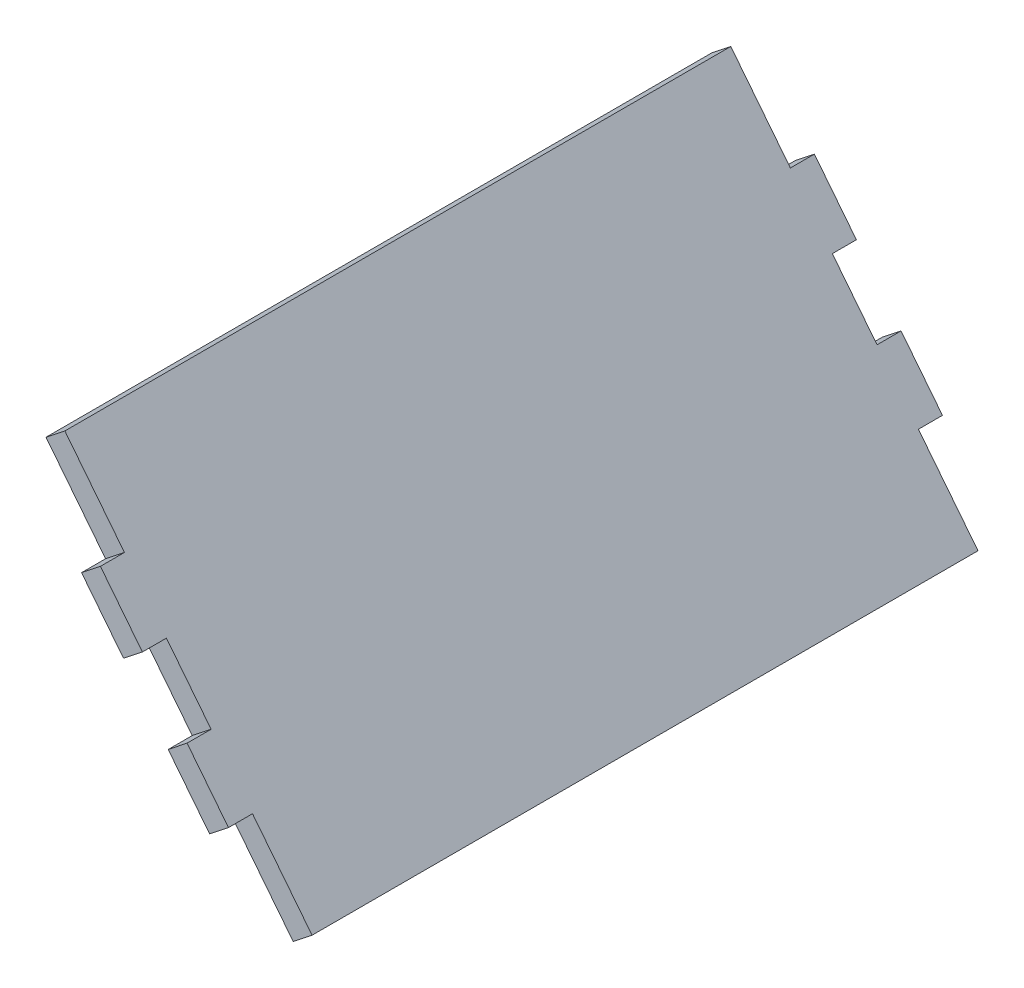
ISO-10303-21;
HEADER;
FILE_DESCRIPTION(('STEP AP214'),'2;1');
FILE_NAME('part.step','',(''),(''),'','','');
FILE_SCHEMA(('AUTOMOTIVE_DESIGN { 1 0 10303 214 1 1 1 1 }'));
ENDSEC;
DATA;
#1=APPLICATION_CONTEXT('core data for automotive mechanical design processes');
#2=APPLICATION_PROTOCOL_DEFINITION('international standard','automotive_design',2000,#1);
#3=PRODUCT_CONTEXT('',#1,'mechanical');
#4=PRODUCT('Part','Part','',(#3));
#5=PRODUCT_RELATED_PRODUCT_CATEGORY('part','',(#4));
#6=PRODUCT_DEFINITION_FORMATION('','',#4);
#7=PRODUCT_DEFINITION_CONTEXT('part definition',#1,'design');
#8=PRODUCT_DEFINITION('design','',#6,#7);
#9=PRODUCT_DEFINITION_SHAPE('','',#8);
#10=(LENGTH_UNIT() NAMED_UNIT(*) SI_UNIT(.MILLI.,.METRE.));
#11=(NAMED_UNIT(*) PLANE_ANGLE_UNIT() SI_UNIT($,.RADIAN.));
#12=(NAMED_UNIT(*) SI_UNIT($,.STERADIAN.) SOLID_ANGLE_UNIT());
#13=UNCERTAINTY_MEASURE_WITH_UNIT(LENGTH_MEASURE(1.E-05),#10,'distance_accuracy_value','');
#14=(GEOMETRIC_REPRESENTATION_CONTEXT(3) GLOBAL_UNCERTAINTY_ASSIGNED_CONTEXT((#13)) GLOBAL_UNIT_ASSIGNED_CONTEXT((#10,
#11,#12)) REPRESENTATION_CONTEXT('',''));
#15=CARTESIAN_POINT('',(0.,0.,0.));
#16=DIRECTION('',(0.,0.,1.));
#17=DIRECTION('',(1.,0.,0.));
#18=AXIS2_PLACEMENT_3D('',#15,#16,#17);
#19=CARTESIAN_POINT('',(-92.709964426378,65.3502134877913,-94.3225113786893));
#20=DIRECTION('',(-0.784882765533394,-0.619644288579062,0.));
#21=DIRECTION('',(0.619644288579062,-0.784882765533394,0.));
#22=AXIS2_PLACEMENT_3D('',#19,#20,#21);
#23=PLANE('',#22);
#24=DIRECTION('',(0.619644288579062,-0.784882765533394,0.));
#25=VECTOR('',#24,1.);
#26=CARTESIAN_POINT('',(-92.709964426378,65.3502134877913,-3.175));
#27=LINE('',#26,#25);
#28=CARTESIAN_POINT('',(-67.9212374961534,33.9511593761769,-3.17499999999999));
#29=VERTEX_POINT('',#28);
#30=CARTESIAN_POINT('',(-60.0517550311992,23.9831482539026,-3.17500000000017));
#31=VERTEX_POINT('',#30);
#32=EDGE_CURVE('E177',#29,#31,#27,.T.);
#33=ORIENTED_EDGE('',*,*,#32,.F.);
#34=DIRECTION('',(0.,0.,1.));
#35=VECTOR('',#34,1.);
#36=CARTESIAN_POINT('',(-67.9212374961535,33.9511593761769,-94.3225113786893));
#37=LINE('',#36,#35);
#38=CARTESIAN_POINT('',(-67.9212374961535,33.9511593761769,1.32272665043232E-13));
#39=VERTEX_POINT('',#38);
#40=EDGE_CURVE('E358',#29,#39,#37,.T.);
#41=ORIENTED_EDGE('',*,*,#40,.T.);
#42=DIRECTION('',(0.619644288579062,-0.784882765533394,0.));
#43=VECTOR('',#42,1.);
#44=CARTESIAN_POINT('',(-92.709964426378,65.3502134877913,0.));
#45=LINE('',#44,#43);
#46=CARTESIAN_POINT('',(-73.3905278092966,40.8789271061575,0.));
#47=VERTEX_POINT('',#46);
#48=EDGE_CURVE('E238',#47,#39,#45,.T.);
#49=ORIENTED_EDGE('',*,*,#48,.F.);
#50=DIRECTION('',(0.,0.,1.));
#51=VECTOR('',#50,1.);
#52=CARTESIAN_POINT('',(-73.3905278092968,40.8789271061577,-94.3225113786893));
#53=LINE('',#52,#51);
#54=CARTESIAN_POINT('',(-73.3905278092966,40.8789271061575,-3.17500000000011));
#55=VERTEX_POINT('',#54);
#56=EDGE_CURVE('E55',#55,#47,#53,.T.);
#57=ORIENTED_EDGE('',*,*,#56,.F.);
#58=DIRECTION('',(-0.619644288579062,0.784882765533394,0.));
#59=VECTOR('',#58,1.);
#60=CARTESIAN_POINT('',(-92.7099644263781,65.3502134877914,-3.17500000000001));
#61=LINE('',#60,#59);
#62=CARTESIAN_POINT('',(-79.2926396580122,48.3549354478631,-3.17500000000001));
#63=VERTEX_POINT('',#62);
#64=EDGE_CURVE('E333',#55,#63,#61,.T.);
#65=ORIENTED_EDGE('',*,*,#64,.T.);
#66=DIRECTION('',(0.,0.,1.));
#67=VECTOR('',#66,1.);
#68=CARTESIAN_POINT('',(-79.2926396580122,48.3549354478632,-94.3225113786893));
#69=LINE('',#68,#67);
#70=CARTESIAN_POINT('',(-79.2926396580122,48.3549354478631,0.));
#71=VERTEX_POINT('',#70);
#72=EDGE_CURVE('E337',#63,#71,#69,.T.);
#73=ORIENTED_EDGE('',*,*,#72,.T.);
#74=CARTESIAN_POINT('',(-84.8404819614249,55.3822023655185,0.));
#75=VERTEX_POINT('',#74);
#76=EDGE_CURVE('E225',#75,#71,#45,.T.);
#77=ORIENTED_EDGE('',*,*,#76,.F.);
#78=DIRECTION('',(0.,0.,1.));
#79=VECTOR('',#78,1.);
#80=CARTESIAN_POINT('',(-84.8404819614249,55.3822023655185,-94.3225113786893));
#81=LINE('',#80,#79);
#82=CARTESIAN_POINT('',(-84.8404819614249,55.3822023655185,-3.17500000000002));
#83=VERTEX_POINT('',#82);
#84=EDGE_CURVE('E260',#83,#75,#81,.T.);
#85=ORIENTED_EDGE('',*,*,#84,.F.);
#86=DIRECTION('',(-0.619644288579062,0.784882765533394,0.));
#87=VECTOR('',#86,1.);
#88=CARTESIAN_POINT('',(-92.709964426378,65.3502134877913,-3.17500000000003));
#89=LINE('',#88,#87);
#90=CARTESIAN_POINT('',(-92.709964426379,65.3502134877926,-3.17500000000006));
#91=VERTEX_POINT('',#90);
#92=EDGE_CURVE('E259',#83,#91,#89,.T.);
#93=ORIENTED_EDGE('',*,*,#92,.T.);
#94=DIRECTION('',(0.,0.,1.));
#95=VECTOR('',#94,1.);
#96=CARTESIAN_POINT('',(-92.709964426378,65.3502134877913,-94.3225113786893));
#97=LINE('',#96,#95);
#98=CARTESIAN_POINT('',(-92.7099644263782,65.3502134877915,-91.1475113786894));
#99=VERTEX_POINT('',#98);
#100=EDGE_CURVE('E197',#99,#91,#97,.T.);
#101=ORIENTED_EDGE('',*,*,#100,.F.);
#102=DIRECTION('',(-0.619644288579062,0.784882765533394,0.));
#103=VECTOR('',#102,1.);
#104=CARTESIAN_POINT('',(-92.709964426378,65.3502134877913,-91.1475113786894));
#105=LINE('',#104,#103);
#106=CARTESIAN_POINT('',(-84.8404819614241,55.3822023655174,-91.1475113786894));
#107=VERTEX_POINT('',#106);
#108=EDGE_CURVE('E236',#107,#99,#105,.T.);
#109=ORIENTED_EDGE('',*,*,#108,.F.);
#110=DIRECTION('',(0.,0.,-1.));
#111=VECTOR('',#110,1.);
#112=CARTESIAN_POINT('',(-84.8404819614241,55.3822023655175,-94.3225113786893));
#113=LINE('',#112,#111);
#114=CARTESIAN_POINT('',(-84.8404819614241,55.3822023655175,-94.3225113786895));
#115=VERTEX_POINT('',#114);
#116=EDGE_CURVE('E239',#107,#115,#113,.T.);
#117=ORIENTED_EDGE('',*,*,#116,.T.);
#118=DIRECTION('',(0.619644288579062,-0.784882765533394,0.));
#119=VECTOR('',#118,1.);
#120=CARTESIAN_POINT('',(-92.709964426378,65.3502134877913,-94.3225113786893));
#121=LINE('',#120,#119);
#122=CARTESIAN_POINT('',(-79.292639658011,48.3549354478616,-94.3225113786898));
#123=VERTEX_POINT('',#122);
#124=EDGE_CURVE('E194',#115,#123,#121,.T.);
#125=ORIENTED_EDGE('',*,*,#124,.T.);
#126=DIRECTION('',(0.,0.,-1.));
#127=VECTOR('',#126,1.);
#128=CARTESIAN_POINT('',(-79.292639658011,48.3549354478616,-94.3225113786893));
#129=LINE('',#128,#127);
#130=CARTESIAN_POINT('',(-79.292639658011,48.3549354478616,-91.1475113786896));
#131=VERTEX_POINT('',#130);
#132=EDGE_CURVE('E298',#131,#123,#129,.T.);
#133=ORIENTED_EDGE('',*,*,#132,.F.);
#134=DIRECTION('',(-0.619644288579062,0.784882765533394,0.));
#135=VECTOR('',#134,1.);
#136=CARTESIAN_POINT('',(-92.709964426378,65.3502134877913,-91.1475113786894));
#137=LINE('',#136,#135);
#138=CARTESIAN_POINT('',(-73.3905278092954,40.878927106156,-91.1475113786896));
#139=VERTEX_POINT('',#138);
#140=EDGE_CURVE('E300',#139,#131,#137,.T.);
#141=ORIENTED_EDGE('',*,*,#140,.F.);
#142=DIRECTION('',(0.,0.,-1.));
#143=VECTOR('',#142,1.);
#144=CARTESIAN_POINT('',(-73.3905278092955,40.8789271061561,-94.3225113786892));
#145=LINE('',#144,#143);
#146=CARTESIAN_POINT('',(-73.3905278092954,40.878927106156,-94.3225113786897));
#147=VERTEX_POINT('',#146);
#148=EDGE_CURVE('E294',#139,#147,#145,.T.);
#149=ORIENTED_EDGE('',*,*,#148,.T.);
#150=CARTESIAN_POINT('',(-67.9212374961523,33.9511593761755,-94.3225113786894));
#151=VERTEX_POINT('',#150);
#152=EDGE_CURVE('E200',#147,#151,#121,.T.);
#153=ORIENTED_EDGE('',*,*,#152,.T.);
#154=DIRECTION('',(0.,0.,-1.));
#155=VECTOR('',#154,1.);
#156=CARTESIAN_POINT('',(-67.9212374961524,33.9511593761755,-94.3225113786893));
#157=LINE('',#156,#155);
#158=CARTESIAN_POINT('',(-67.9212374961524,33.9511593761756,-91.1475113786897));
#159=VERTEX_POINT('',#158);
#160=EDGE_CURVE('E280',#159,#151,#157,.T.);
#161=ORIENTED_EDGE('',*,*,#160,.F.);
#162=DIRECTION('',(0.619644288579062,-0.784882765533394,0.));
#163=VECTOR('',#162,1.);
#164=CARTESIAN_POINT('',(-92.709964426378,65.3502134877913,-91.1475113786894));
#165=LINE('',#164,#163);
#166=CARTESIAN_POINT('',(-60.0517550311982,23.9831482539014,-91.1475113786896));
#167=VERTEX_POINT('',#166);
#168=EDGE_CURVE('E276',#159,#167,#165,.T.);
#169=ORIENTED_EDGE('',*,*,#168,.T.);
#170=DIRECTION('',(0.,0.,1.));
#171=VECTOR('',#170,1.);
#172=CARTESIAN_POINT('',(-60.0517550311979,23.983148253901,-94.3225113786893));
#173=LINE('',#172,#171);
#174=EDGE_CURVE('E207',#167,#31,#173,.T.);
#175=ORIENTED_EDGE('',*,*,#174,.T.);
#176=EDGE_LOOP('',(#33,#41,#49,#57,#65,#73,#77,#85,#93,#101,#109,#117,#125,#133,#141,#149,#153,
#161,#169,#175));
#177=FACE_BOUND('',#176,.T.);
#178=ADVANCED_FACE('F33',(#177),#23,.T.);
#179=CARTESIAN_POINT('',(-57.5597522506294,25.9505188701395,-94.3225113786893));
#180=DIRECTION('',(0.784882765533394,0.619644288579062,0.));
#181=DIRECTION('',(-0.619644288579062,0.784882765533394,0.));
#182=AXIS2_PLACEMENT_3D('',#179,#180,#181);
#183=PLANE('',#182);
#184=DIRECTION('',(-0.619644288579062,0.784882765533394,0.));
#185=VECTOR('',#184,1.);
#186=CARTESIAN_POINT('',(-57.5597522506294,25.9505188701395,0.));
#187=LINE('',#186,#185);
#188=CARTESIAN_POINT('',(-65.4292347155827,35.9185299924127,0.));
#189=VERTEX_POINT('',#188);
#190=CARTESIAN_POINT('',(-70.8985250287306,42.8462977223941,0.));
#191=VERTEX_POINT('',#190);
#192=EDGE_CURVE('E235',#189,#191,#187,.T.);
#193=ORIENTED_EDGE('',*,*,#192,.F.);
#194=DIRECTION('',(0.,0.,-1.));
#195=VECTOR('',#194,1.);
#196=CARTESIAN_POINT('',(-65.4292347155873,35.9185299924136,1.32272665043232E-13));
#197=LINE('',#196,#195);
#198=CARTESIAN_POINT('',(-65.4292347155871,35.9185299924136,-3.17499999999997));
#199=VERTEX_POINT('',#198);
#200=EDGE_CURVE('E48',#189,#199,#197,.T.);
#201=ORIENTED_EDGE('',*,*,#200,.T.);
#202=DIRECTION('',(-0.619644288579095,0.784882765533393,0.));
#203=VECTOR('',#202,1.);
#204=CARTESIAN_POINT('',(-22.8381786424668,-18.0301410335283,-3.17500000000002));
#205=LINE('',#204,#203);
#206=CARTESIAN_POINT('',(-57.5597522506328,25.9505188701395,-3.17500000000017));
#207=VERTEX_POINT('',#206);
#208=EDGE_CURVE('E175',#207,#199,#205,.T.);
#209=ORIENTED_EDGE('',*,*,#208,.F.);
#210=DIRECTION('',(0.,0.,1.));
#211=VECTOR('',#210,1.);
#212=CARTESIAN_POINT('',(-57.5597522506294,25.9505188701395,-94.3225113786893));
#213=LINE('',#212,#211);
#214=CARTESIAN_POINT('',(-57.5597522506294,25.9505188701395,-91.1475113786896));
#215=VERTEX_POINT('',#214);
#216=EDGE_CURVE('E189',#215,#207,#213,.T.);
#217=ORIENTED_EDGE('',*,*,#216,.F.);
#218=DIRECTION('',(-0.619644288579071,0.784882765533393,0.));
#219=VECTOR('',#218,1.);
#220=CARTESIAN_POINT('',(-22.8381786424668,-18.0301410335283,-91.1475113786894));
#221=LINE('',#220,#219);
#222=CARTESIAN_POINT('',(-65.4292347155844,35.9185299924136,-91.1475113786897));
#223=VERTEX_POINT('',#222);
#224=EDGE_CURVE('E263',#215,#223,#221,.T.);
#225=ORIENTED_EDGE('',*,*,#224,.T.);
#226=DIRECTION('',(0.,0.,1.));
#227=VECTOR('',#226,1.);
#228=CARTESIAN_POINT('',(-65.4292347155844,35.9185299924136,0.));
#229=LINE('',#228,#227);
#230=CARTESIAN_POINT('',(-65.4292347155842,35.9185299924136,-94.3225113786896));
#231=VERTEX_POINT('',#230);
#232=EDGE_CURVE('E265',#231,#223,#229,.T.);
#233=ORIENTED_EDGE('',*,*,#232,.F.);
#234=DIRECTION('',(-0.619644288579062,0.784882765533394,0.));
#235=VECTOR('',#234,1.);
#236=CARTESIAN_POINT('',(-57.5597522506294,25.9505188701395,-94.3225113786893));
#237=LINE('',#236,#235);
#238=CARTESIAN_POINT('',(-70.8985250287265,42.846297722394,-94.3225113786893));
#239=VERTEX_POINT('',#238);
#240=EDGE_CURVE('E311',#231,#239,#237,.T.);
#241=ORIENTED_EDGE('',*,*,#240,.T.);
#242=DIRECTION('',(0.,0.,1.));
#243=VECTOR('',#242,1.);
#244=CARTESIAN_POINT('',(-70.8985250287277,42.8462977223943,-2.6324428747948E-13));
#245=LINE('',#244,#243);
#246=CARTESIAN_POINT('',(-70.8985250287274,42.8462977223941,-91.1475113786897));
#247=VERTEX_POINT('',#246);
#248=EDGE_CURVE('E288',#239,#247,#245,.T.);
#249=ORIENTED_EDGE('',*,*,#248,.T.);
#250=DIRECTION('',(0.619644288579069,-0.784882765533393,0.));
#251=VECTOR('',#250,1.);
#252=CARTESIAN_POINT('',(-22.838178642467,-18.0301410335282,-91.1475113786896));
#253=LINE('',#252,#251);
#254=CARTESIAN_POINT('',(-76.8006368774431,50.3223060640997,-91.1475113786898));
#255=VERTEX_POINT('',#254);
#256=EDGE_CURVE('E285',#255,#247,#253,.T.);
#257=ORIENTED_EDGE('',*,*,#256,.F.);
#258=DIRECTION('',(0.,0.,1.));
#259=VECTOR('',#258,1.);
#260=CARTESIAN_POINT('',(-76.8006368774431,50.3223060640997,0.));
#261=LINE('',#260,#259);
#262=CARTESIAN_POINT('',(-76.800636877443,50.3223060640997,-94.3225113786898));
#263=VERTEX_POINT('',#262);
#264=EDGE_CURVE('E282',#263,#255,#261,.T.);
#265=ORIENTED_EDGE('',*,*,#264,.F.);
#266=CARTESIAN_POINT('',(-82.3484791808554,57.3495729817558,-94.3225113786893));
#267=VERTEX_POINT('',#266);
#268=EDGE_CURVE('E244',#263,#267,#237,.T.);
#269=ORIENTED_EDGE('',*,*,#268,.T.);
#270=DIRECTION('',(0.,0.,1.));
#271=VECTOR('',#270,1.);
#272=CARTESIAN_POINT('',(-82.3484791808559,57.3495729817558,0.));
#273=LINE('',#272,#271);
#274=CARTESIAN_POINT('',(-82.3484791808558,57.3495729817558,-91.1475113786894));
#275=VERTEX_POINT('',#274);
#276=EDGE_CURVE('E305',#267,#275,#273,.T.);
#277=ORIENTED_EDGE('',*,*,#276,.T.);
#278=DIRECTION('',(0.619644288579065,-0.784882765533393,0.));
#279=VECTOR('',#278,1.);
#280=CARTESIAN_POINT('',(-22.8381786424668,-18.0301410335283,-91.1475113786894));
#281=LINE('',#280,#279);
#282=CARTESIAN_POINT('',(-90.21796164581,67.3175841040298,-91.1475113786894));
#283=VERTEX_POINT('',#282);
#284=EDGE_CURVE('E302',#283,#275,#281,.T.);
#285=ORIENTED_EDGE('',*,*,#284,.F.);
#286=DIRECTION('',(0.,0.,1.));
#287=VECTOR('',#286,1.);
#288=CARTESIAN_POINT('',(-90.2179616458095,67.3175841040298,-94.3225113786893));
#289=LINE('',#288,#287);
#290=CARTESIAN_POINT('',(-90.2179616458121,67.3175841040298,-3.17500000000006));
#291=VERTEX_POINT('',#290);
#292=EDGE_CURVE('E193',#283,#291,#289,.T.);
#293=ORIENTED_EDGE('',*,*,#292,.T.);
#294=DIRECTION('',(0.619644288579081,-0.784882765533393,0.));
#295=VECTOR('',#294,1.);
#296=CARTESIAN_POINT('',(-22.8381786424668,-18.0301410335283,-3.17500000000002));
#297=LINE('',#296,#295);
#298=CARTESIAN_POINT('',(-82.348479180858,57.3495729817558,-3.17500000000002));
#299=VERTEX_POINT('',#298);
#300=EDGE_CURVE('E332',#291,#299,#297,.T.);
#301=ORIENTED_EDGE('',*,*,#300,.T.);
#302=DIRECTION('',(0.,0.,-1.));
#303=VECTOR('',#302,1.);
#304=CARTESIAN_POINT('',(-82.348479180858,57.3495729817558,0.));
#305=LINE('',#304,#303);
#306=CARTESIAN_POINT('',(-82.348479180858,57.3495729817558,0.));
#307=VERTEX_POINT('',#306);
#308=EDGE_CURVE('E234',#307,#299,#305,.T.);
#309=ORIENTED_EDGE('',*,*,#308,.F.);
#310=CARTESIAN_POINT('',(-76.8006368774463,50.3223060640997,0.));
#311=VERTEX_POINT('',#310);
#312=EDGE_CURVE('E223',#311,#307,#187,.T.);
#313=ORIENTED_EDGE('',*,*,#312,.F.);
#314=DIRECTION('',(0.,0.,-1.));
#315=VECTOR('',#314,1.);
#316=CARTESIAN_POINT('',(-76.8006368774463,50.3223060640997,0.));
#317=LINE('',#316,#315);
#318=CARTESIAN_POINT('',(-76.8006368774462,50.3223060640997,-3.17500000000002));
#319=VERTEX_POINT('',#318);
#320=EDGE_CURVE('E231',#311,#319,#317,.T.);
#321=ORIENTED_EDGE('',*,*,#320,.T.);
#322=DIRECTION('',(0.619644288579094,-0.784882765533393,0.));
#323=VECTOR('',#322,1.);
#324=CARTESIAN_POINT('',(-22.8381786424668,-18.0301410335283,-3.17499999999988));
#325=LINE('',#324,#323);
#326=CARTESIAN_POINT('',(-70.8985250287305,42.8462977223941,-3.17500000000011));
#327=VERTEX_POINT('',#326);
#328=EDGE_CURVE('E350',#319,#327,#325,.T.);
#329=ORIENTED_EDGE('',*,*,#328,.T.);
#330=DIRECTION('',(0.,0.,-1.));
#331=VECTOR('',#330,1.);
#332=CARTESIAN_POINT('',(-70.8985250287304,42.8462977223941,1.73906028466675E-13));
#333=LINE('',#332,#331);
#334=EDGE_CURVE('E353',#191,#327,#333,.T.);
#335=ORIENTED_EDGE('',*,*,#334,.F.);
#336=EDGE_LOOP('',(#193,#201,#209,#217,#225,#233,#241,#249,#257,#265,#269,#277,#285,#293,#301,
#309,#313,#321,#329,#335));
#337=FACE_BOUND('',#336,.T.);
#338=ADVANCED_FACE('F187',(#337),#183,.T.);
#339=CARTESIAN_POINT('',(0.,0.,0.));
#340=DIRECTION('',(0.,0.,1.));
#341=DIRECTION('',(1.,0.,0.));
#342=AXIS2_PLACEMENT_3D('',#339,#340,#341);
#343=PLANE('',#342);
#344=ORIENTED_EDGE('',*,*,#48,.T.);
#345=DIRECTION('',(0.784882765533394,0.619644288579062,0.));
#346=VECTOR('',#345,1.);
#347=CARTESIAN_POINT('',(-42.5910560731182,53.9486710259438,0.));
#348=LINE('',#347,#346);
#349=EDGE_CURVE('E11',#39,#189,#348,.T.);
#350=ORIENTED_EDGE('',*,*,#349,.T.);
#351=ORIENTED_EDGE('',*,*,#192,.T.);
#352=DIRECTION('',(0.784882765533394,0.619644288579062,0.));
#353=VECTOR('',#352,1.);
#354=CARTESIAN_POINT('',(-48.0603463862613,60.8764387559244,0.));
#355=LINE('',#354,#353);
#356=EDGE_CURVE('E216',#47,#191,#355,.T.);
#357=ORIENTED_EDGE('',*,*,#356,.F.);
#358=EDGE_LOOP('',(#344,#350,#351,#357));
#359=FACE_BOUND('',#358,.T.);
#360=ADVANCED_FACE('F399',(#359),#343,.T.);
#361=ORIENTED_EDGE('',*,*,#76,.T.);
#362=DIRECTION('',(0.784882765533394,0.619644288579062,0.));
#363=VECTOR('',#362,1.);
#364=CARTESIAN_POINT('',(-53.9624582349769,68.35244709763,0.));
#365=LINE('',#364,#363);
#366=EDGE_CURVE('E41',#71,#311,#365,.T.);
#367=ORIENTED_EDGE('',*,*,#366,.T.);
#368=ORIENTED_EDGE('',*,*,#312,.T.);
#369=DIRECTION('',(0.784882765533394,0.619644288579062,0.));
#370=VECTOR('',#369,1.);
#371=CARTESIAN_POINT('',(-59.5103005383897,75.3797140152854,0.));
#372=LINE('',#371,#370);
#373=EDGE_CURVE('E213',#75,#307,#372,.T.);
#374=ORIENTED_EDGE('',*,*,#373,.F.);
#375=EDGE_LOOP('',(#361,#367,#368,#374));
#376=FACE_BOUND('',#375,.T.);
#377=ADVANCED_FACE('F221',(#376),#343,.T.);
#378=CARTESIAN_POINT('',(-90.2179616458095,67.3175841040298,-94.3225113786893));
#379=DIRECTION('',(-0.619644288579064,0.784882765533392,0.));
#380=DIRECTION('',(-0.784882765533392,-0.619644288579064,0.));
#381=AXIS2_PLACEMENT_3D('',#378,#379,#380);
#382=PLANE('',#381);
#383=ORIENTED_EDGE('',*,*,#100,.T.);
#384=DIRECTION('',(0.784882765533394,0.619644288579062,0.));
#385=VECTOR('',#384,1.);
#386=CARTESIAN_POINT('',(-112.828758951396,49.4669546522513,-3.17500000000006));
#387=LINE('',#386,#385);
#388=EDGE_CURVE('E252',#91,#291,#387,.T.);
#389=ORIENTED_EDGE('',*,*,#388,.T.);
#390=ORIENTED_EDGE('',*,*,#292,.F.);
#391=DIRECTION('',(0.784882765533394,0.619644288579062,0.));
#392=VECTOR('',#391,1.);
#393=CARTESIAN_POINT('',(-112.828758951394,49.4669546522513,-91.1475113786894));
#394=LINE('',#393,#392);
#395=EDGE_CURVE('E253',#99,#283,#394,.T.);
#396=ORIENTED_EDGE('',*,*,#395,.F.);
#397=EDGE_LOOP('',(#383,#389,#390,#396));
#398=FACE_BOUND('',#397,.T.);
#399=ADVANCED_FACE('F250',(#398),#382,.T.);
#400=CARTESIAN_POINT('',(-60.0517550311979,23.983148253901,-94.3225113786893));
#401=DIRECTION('',(0.619644288579064,-0.784882765533392,0.));
#402=DIRECTION('',(0.784882765533392,0.619644288579064,0.));
#403=AXIS2_PLACEMENT_3D('',#400,#401,#402);
#404=PLANE('',#403);
#405=DIRECTION('',(0.784882765533394,0.619644288579062,0.));
#406=VECTOR('',#405,1.);
#407=CARTESIAN_POINT('',(-80.1705495562165,8.09988941836095,-3.17500000000017));
#408=LINE('',#407,#406);
#409=EDGE_CURVE('E171',#31,#207,#408,.T.);
#410=ORIENTED_EDGE('',*,*,#409,.F.);
#411=ORIENTED_EDGE('',*,*,#174,.F.);
#412=DIRECTION('',(0.784882765533392,0.619644288579064,0.));
#413=VECTOR('',#412,1.);
#414=CARTESIAN_POINT('',(-60.0517550311979,23.983148253901,-91.1475113786894));
#415=LINE('',#414,#413);
#416=EDGE_CURVE('E192',#167,#215,#415,.T.);
#417=ORIENTED_EDGE('',*,*,#416,.T.);
#418=ORIENTED_EDGE('',*,*,#216,.T.);
#419=EDGE_LOOP('',(#410,#411,#417,#418));
#420=FACE_BOUND('',#419,.T.);
#421=ADVANCED_FACE('F35',(#420),#404,.T.);
#422=CARTESIAN_POINT('',(0.,0.,-94.3225113786893));
#423=DIRECTION('',(0.,0.,1.));
#424=DIRECTION('',(1.,0.,0.));
#425=AXIS2_PLACEMENT_3D('',#422,#423,#424);
#426=PLANE('',#425);
#427=ORIENTED_EDGE('',*,*,#240,.F.);
#428=DIRECTION('',(0.784882765533394,0.619644288579062,0.));
#429=VECTOR('',#428,1.);
#430=CARTESIAN_POINT('',(-88.0400320211679,18.0679005406351,-94.3225113786896));
#431=LINE('',#430,#429);
#432=EDGE_CURVE('E273',#151,#231,#431,.T.);
#433=ORIENTED_EDGE('',*,*,#432,.F.);
#434=ORIENTED_EDGE('',*,*,#152,.F.);
#435=DIRECTION('',(-0.784882765533394,-0.619644288579062,0.));
#436=VECTOR('',#435,1.);
#437=CARTESIAN_POINT('',(-48.0603463862602,60.8764387559229,-94.3225113786893));
#438=LINE('',#437,#436);
#439=EDGE_CURVE('E206',#239,#147,#438,.T.);
#440=ORIENTED_EDGE('',*,*,#439,.F.);
#441=EDGE_LOOP('',(#427,#433,#434,#440));
#442=FACE_BOUND('',#441,.T.);
#443=ADVANCED_FACE('F374',(#442),#426,.F.);
#444=ORIENTED_EDGE('',*,*,#268,.F.);
#445=DIRECTION('',(-0.784882765533394,-0.619644288579062,0.));
#446=VECTOR('',#445,1.);
#447=CARTESIAN_POINT('',(-53.9624582349757,68.3524470976285,-94.3225113786893));
#448=LINE('',#447,#446);
#449=EDGE_CURVE('E209',#263,#123,#448,.T.);
#450=ORIENTED_EDGE('',*,*,#449,.T.);
#451=ORIENTED_EDGE('',*,*,#124,.F.);
#452=DIRECTION('',(-0.784882765533394,-0.619644288579062,0.));
#453=VECTOR('',#452,1.);
#454=CARTESIAN_POINT('',(-59.5103005383888,75.3797140152843,-94.3225113786893));
#455=LINE('',#454,#453);
#456=EDGE_CURVE('E204',#267,#115,#455,.T.);
#457=ORIENTED_EDGE('',*,*,#456,.F.);
#458=EDGE_LOOP('',(#444,#450,#451,#457));
#459=FACE_BOUND('',#458,.T.);
#460=ADVANCED_FACE('F327',(#459),#426,.F.);
#461=CARTESIAN_POINT('',(-104.95927648644,39.4989435299772,0.));
#462=DIRECTION('',(-0.619644288579062,0.784882765533394,0.));
#463=DIRECTION('',(-0.784882765533394,-0.619644288579062,0.));
#464=AXIS2_PLACEMENT_3D('',#461,#462,#463);
#465=PLANE('',#464);
#466=DIRECTION('',(0.784882765533394,0.619644288579062,0.));
#467=VECTOR('',#466,1.);
#468=CARTESIAN_POINT('',(-104.95927648644,39.4989435299772,-91.1475113786894));
#469=LINE('',#468,#467);
#470=EDGE_CURVE('E308',#107,#275,#469,.T.);
#471=ORIENTED_EDGE('',*,*,#470,.T.);
#472=ORIENTED_EDGE('',*,*,#276,.F.);
#473=ORIENTED_EDGE('',*,*,#456,.T.);
#474=ORIENTED_EDGE('',*,*,#116,.F.);
#475=EDGE_LOOP('',(#471,#472,#473,#474));
#476=FACE_BOUND('',#475,.T.);
#477=ADVANCED_FACE('F324',(#476),#465,.T.);
#478=CARTESIAN_POINT('',(-45.4489759480505,-35.8807704853069,-91.1475113786894));
#479=DIRECTION('',(0.,0.,1.));
#480=DIRECTION('',(0.,-1.,0.));
#481=AXIS2_PLACEMENT_3D('',#478,#479,#480);
#482=PLANE('',#481);
#483=ORIENTED_EDGE('',*,*,#108,.T.);
#484=ORIENTED_EDGE('',*,*,#395,.T.);
#485=ORIENTED_EDGE('',*,*,#284,.T.);
#486=ORIENTED_EDGE('',*,*,#470,.F.);
#487=EDGE_LOOP('',(#483,#484,#485,#486));
#488=FACE_BOUND('',#487,.T.);
#489=ADVANCED_FACE('F331',(#488),#482,.F.);
#490=CARTESIAN_POINT('',(-99.4114341830268,32.4716766123212,0.));
#491=DIRECTION('',(-0.619644288579062,0.784882765533394,0.));
#492=DIRECTION('',(-0.784882765533394,-0.619644288579062,0.));
#493=AXIS2_PLACEMENT_3D('',#490,#491,#492);
#494=PLANE('',#493);
#495=ORIENTED_EDGE('',*,*,#132,.T.);
#496=ORIENTED_EDGE('',*,*,#449,.F.);
#497=ORIENTED_EDGE('',*,*,#264,.T.);
#498=DIRECTION('',(0.784882765533394,0.619644288579062,0.));
#499=VECTOR('',#498,1.);
#500=CARTESIAN_POINT('',(-99.4114341830268,32.4716766123212,-91.1475113786898));
#501=LINE('',#500,#499);
#502=EDGE_CURVE('E291',#131,#255,#501,.T.);
#503=ORIENTED_EDGE('',*,*,#502,.F.);
#504=EDGE_LOOP('',(#495,#496,#497,#503));
#505=FACE_BOUND('',#504,.T.);
#506=ADVANCED_FACE('F383',(#505),#494,.F.);
#507=CARTESIAN_POINT('',(-93.5093223343114,24.9956682706158,-2.6324428747948E-13));
#508=DIRECTION('',(-0.619644288579062,0.784882765533393,0.));
#509=DIRECTION('',(-0.784882765533394,-0.619644288579062,0.));
#510=AXIS2_PLACEMENT_3D('',#507,#508,#509);
#511=PLANE('',#510);
#512=DIRECTION('',(0.784882765533394,0.619644288579062,0.));
#513=VECTOR('',#512,1.);
#514=CARTESIAN_POINT('',(-93.5093223343111,24.9956682706156,-91.1475113786897));
#515=LINE('',#514,#513);
#516=EDGE_CURVE('E292',#139,#247,#515,.T.);
#517=ORIENTED_EDGE('',*,*,#516,.T.);
#518=ORIENTED_EDGE('',*,*,#248,.F.);
#519=ORIENTED_EDGE('',*,*,#439,.T.);
#520=ORIENTED_EDGE('',*,*,#148,.F.);
#521=EDGE_LOOP('',(#517,#518,#519,#520));
#522=FACE_BOUND('',#521,.T.);
#523=ADVANCED_FACE('F377',(#522),#511,.T.);
#524=CARTESIAN_POINT('',(-45.4489759480507,-35.8807704853068,-91.1475113786896));
#525=DIRECTION('',(0.,0.,1.));
#526=DIRECTION('',(0.,-1.,0.));
#527=AXIS2_PLACEMENT_3D('',#524,#525,#526);
#528=PLANE('',#527);
#529=ORIENTED_EDGE('',*,*,#140,.T.);
#530=ORIENTED_EDGE('',*,*,#502,.T.);
#531=ORIENTED_EDGE('',*,*,#256,.T.);
#532=ORIENTED_EDGE('',*,*,#516,.F.);
#533=EDGE_LOOP('',(#529,#530,#531,#532));
#534=FACE_BOUND('',#533,.T.);
#535=ADVANCED_FACE('F381',(#534),#528,.F.);
#536=CARTESIAN_POINT('',(-45.4489759480505,-35.8807704853069,-91.1475113786894));
#537=DIRECTION('',(0.,0.,-1.));
#538=DIRECTION('',(0.,1.,0.));
#539=AXIS2_PLACEMENT_3D('',#536,#537,#538);
#540=PLANE('',#539);
#541=DIRECTION('',(0.784882765533394,0.619644288579062,0.));
#542=VECTOR('',#541,1.);
#543=CARTESIAN_POINT('',(-88.0400320211681,18.0679005406351,-91.1475113786897));
#544=LINE('',#543,#542);
#545=EDGE_CURVE('E274',#159,#223,#544,.T.);
#546=ORIENTED_EDGE('',*,*,#545,.T.);
#547=ORIENTED_EDGE('',*,*,#224,.F.);
#548=ORIENTED_EDGE('',*,*,#416,.F.);
#549=ORIENTED_EDGE('',*,*,#168,.F.);
#550=EDGE_LOOP('',(#546,#547,#548,#549));
#551=FACE_BOUND('',#550,.T.);
#552=ADVANCED_FACE('F368',(#551),#540,.T.);
#553=CARTESIAN_POINT('',(-88.0400320211681,18.0679005406351,0.));
#554=DIRECTION('',(-0.619644288579062,0.784882765533394,0.));
#555=DIRECTION('',(-0.784882765533394,-0.619644288579062,0.));
#556=AXIS2_PLACEMENT_3D('',#553,#554,#555);
#557=PLANE('',#556);
#558=ORIENTED_EDGE('',*,*,#160,.T.);
#559=ORIENTED_EDGE('',*,*,#432,.T.);
#560=ORIENTED_EDGE('',*,*,#232,.T.);
#561=ORIENTED_EDGE('',*,*,#545,.F.);
#562=EDGE_LOOP('',(#558,#559,#560,#561));
#563=FACE_BOUND('',#562,.T.);
#564=ADVANCED_FACE('F370',(#563),#557,.F.);
#565=CARTESIAN_POINT('',(-45.4489759480505,-35.8807704853069,-3.17500000000002));
#566=DIRECTION('',(0.,0.,1.));
#567=DIRECTION('',(0.,-1.,0.));
#568=AXIS2_PLACEMENT_3D('',#565,#566,#567);
#569=PLANE('',#568);
#570=DIRECTION('',(0.784882765533394,0.619644288579062,0.));
#571=VECTOR('',#570,1.);
#572=CARTESIAN_POINT('',(-104.959276486442,39.4989435299772,-3.17500000000002));
#573=LINE('',#572,#571);
#574=EDGE_CURVE('E267',#83,#299,#573,.T.);
#575=ORIENTED_EDGE('',*,*,#574,.T.);
#576=ORIENTED_EDGE('',*,*,#300,.F.);
#577=ORIENTED_EDGE('',*,*,#388,.F.);
#578=ORIENTED_EDGE('',*,*,#92,.F.);
#579=EDGE_LOOP('',(#575,#576,#577,#578));
#580=FACE_BOUND('',#579,.T.);
#581=ADVANCED_FACE('F341',(#580),#569,.T.);
#582=CARTESIAN_POINT('',(-104.959276486442,39.4989435299772,0.));
#583=DIRECTION('',(0.619644288579062,-0.784882765533394,0.));
#584=DIRECTION('',(0.784882765533394,0.619644288579062,0.));
#585=AXIS2_PLACEMENT_3D('',#582,#583,#584);
#586=PLANE('',#585);
#587=ORIENTED_EDGE('',*,*,#84,.T.);
#588=ORIENTED_EDGE('',*,*,#373,.T.);
#589=ORIENTED_EDGE('',*,*,#308,.T.);
#590=ORIENTED_EDGE('',*,*,#574,.F.);
#591=EDGE_LOOP('',(#587,#588,#589,#590));
#592=FACE_BOUND('',#591,.T.);
#593=ADVANCED_FACE('F343',(#592),#586,.F.);
#594=CARTESIAN_POINT('',(-99.4114341830299,32.4716766123212,0.));
#595=DIRECTION('',(0.619644288579062,-0.784882765533394,0.));
#596=DIRECTION('',(0.784882765533394,0.619644288579062,0.));
#597=AXIS2_PLACEMENT_3D('',#594,#595,#596);
#598=PLANE('',#597);
#599=DIRECTION('',(0.784882765533394,0.619644288579062,0.));
#600=VECTOR('',#599,1.);
#601=CARTESIAN_POINT('',(-99.4114341830299,32.4716766123212,-3.17500000000002));
#602=LINE('',#601,#600);
#603=EDGE_CURVE('E345',#63,#319,#602,.T.);
#604=ORIENTED_EDGE('',*,*,#603,.T.);
#605=ORIENTED_EDGE('',*,*,#320,.F.);
#606=ORIENTED_EDGE('',*,*,#366,.F.);
#607=ORIENTED_EDGE('',*,*,#72,.F.);
#608=EDGE_LOOP('',(#604,#605,#606,#607));
#609=FACE_BOUND('',#608,.T.);
#610=ADVANCED_FACE('F419',(#609),#598,.T.);
#611=CARTESIAN_POINT('',(-45.4489759480505,-35.8807704853069,-3.17499999999988));
#612=DIRECTION('',(0.,0.,1.));
#613=DIRECTION('',(0.,-1.,0.));
#614=AXIS2_PLACEMENT_3D('',#611,#612,#613);
#615=PLANE('',#614);
#616=DIRECTION('',(0.784882765533394,0.619644288579062,0.));
#617=VECTOR('',#616,1.);
#618=CARTESIAN_POINT('',(-93.5093223343142,24.9956682706156,-3.17500000000011));
#619=LINE('',#618,#617);
#620=EDGE_CURVE('E348',#55,#327,#619,.T.);
#621=ORIENTED_EDGE('',*,*,#620,.T.);
#622=ORIENTED_EDGE('',*,*,#328,.F.);
#623=ORIENTED_EDGE('',*,*,#603,.F.);
#624=ORIENTED_EDGE('',*,*,#64,.F.);
#625=EDGE_LOOP('',(#621,#622,#623,#624));
#626=FACE_BOUND('',#625,.T.);
#627=ADVANCED_FACE('F418',(#626),#615,.T.);
#628=CARTESIAN_POINT('',(-93.5093223343142,24.9956682706156,1.73906028466675E-13));
#629=DIRECTION('',(0.619644288579062,-0.784882765533393,0.));
#630=DIRECTION('',(0.784882765533394,0.619644288579062,0.));
#631=AXIS2_PLACEMENT_3D('',#628,#629,#630);
#632=PLANE('',#631);
#633=ORIENTED_EDGE('',*,*,#56,.T.);
#634=ORIENTED_EDGE('',*,*,#356,.T.);
#635=ORIENTED_EDGE('',*,*,#334,.T.);
#636=ORIENTED_EDGE('',*,*,#620,.F.);
#637=EDGE_LOOP('',(#633,#634,#635,#636));
#638=FACE_BOUND('',#637,.T.);
#639=ADVANCED_FACE('F415',(#638),#632,.F.);
#640=CARTESIAN_POINT('',(-88.040032021171,18.0679005406351,1.32272665043232E-13));
#641=DIRECTION('',(0.619644288579062,-0.784882765533394,0.));
#642=DIRECTION('',(0.784882765533394,0.619644288579062,0.));
#643=AXIS2_PLACEMENT_3D('',#640,#641,#642);
#644=PLANE('',#643);
#645=DIRECTION('',(0.784882765533394,0.619644288579062,0.));
#646=VECTOR('',#645,1.);
#647=CARTESIAN_POINT('',(-88.0400320211708,18.0679005406351,-3.17499999999997));
#648=LINE('',#647,#646);
#649=EDGE_CURVE('E182',#29,#199,#648,.T.);
#650=ORIENTED_EDGE('',*,*,#649,.T.);
#651=ORIENTED_EDGE('',*,*,#200,.F.);
#652=ORIENTED_EDGE('',*,*,#349,.F.);
#653=ORIENTED_EDGE('',*,*,#40,.F.);
#654=EDGE_LOOP('',(#650,#651,#652,#653));
#655=FACE_BOUND('',#654,.T.);
#656=ADVANCED_FACE('F362',(#655),#644,.T.);
#657=CARTESIAN_POINT('',(-45.4489759480505,-35.8807704853069,-3.17500000000002));
#658=DIRECTION('',(0.,0.,-1.));
#659=DIRECTION('',(0.,1.,0.));
#660=AXIS2_PLACEMENT_3D('',#657,#658,#659);
#661=PLANE('',#660);
#662=ORIENTED_EDGE('',*,*,#32,.T.);
#663=ORIENTED_EDGE('',*,*,#409,.T.);
#664=ORIENTED_EDGE('',*,*,#208,.T.);
#665=ORIENTED_EDGE('',*,*,#649,.F.);
#666=EDGE_LOOP('',(#662,#663,#664,#665));
#667=FACE_BOUND('',#666,.T.);
#668=ADVANCED_FACE('F173',(#667),#661,.F.);
#669=CLOSED_SHELL('',(#178,#338,#360,#377,#399,#421,#443,#460,#477,#489,#506,#523,#535,#552,
#564,#581,#593,#610,#627,#639,#656,#668));
#670=MANIFOLD_SOLID_BREP('B2',#669);
#671=ADVANCED_BREP_SHAPE_REPRESENTATION('',(#18,#670),#14);
#672=SHAPE_DEFINITION_REPRESENTATION(#9,#671);
ENDSEC;
END-ISO-10303-21;
